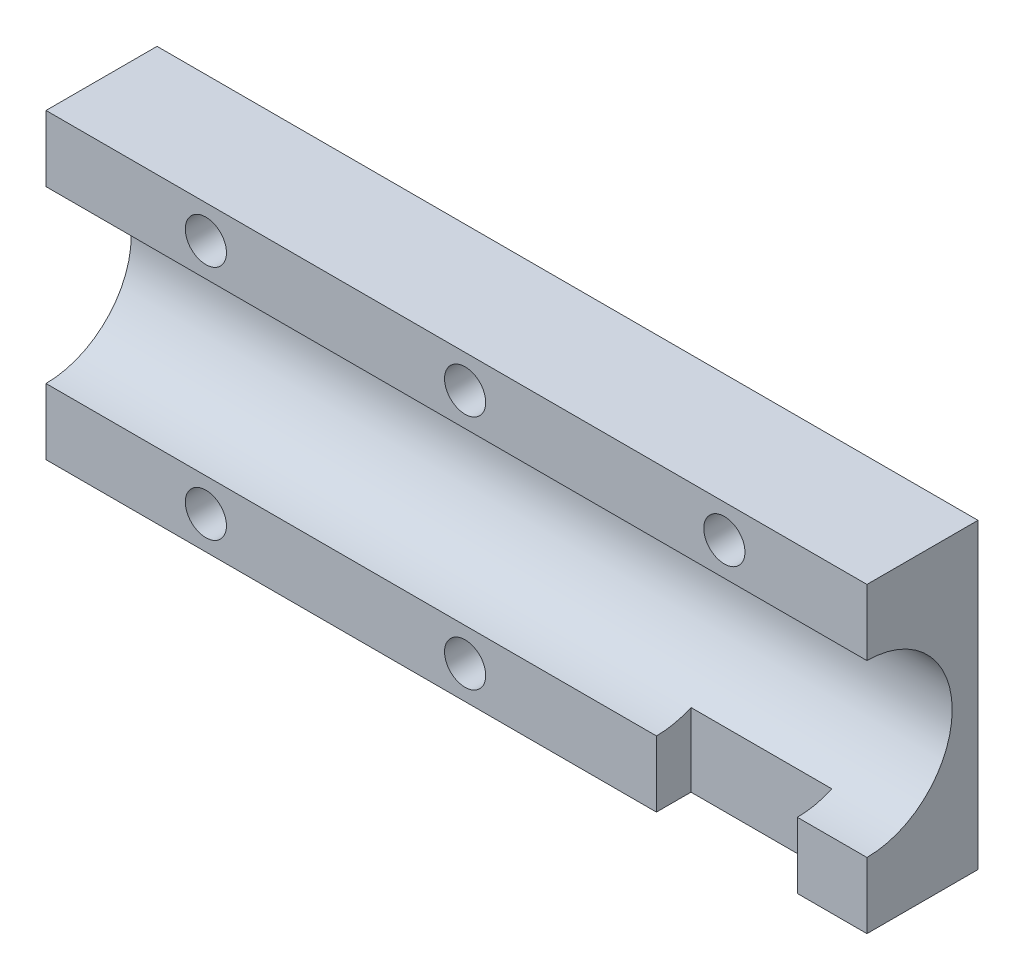
ISO-10303-21;
HEADER;
FILE_DESCRIPTION(('STEP AP214'),'2;1');
FILE_NAME('part.step','',(''),(''),'','','');
FILE_SCHEMA(('AUTOMOTIVE_DESIGN { 1 0 10303 214 1 1 1 1 }'));
ENDSEC;
DATA;
#1=APPLICATION_CONTEXT('core data for automotive mechanical design processes');
#2=APPLICATION_PROTOCOL_DEFINITION('international standard','automotive_design',2000,#1);
#3=PRODUCT_CONTEXT('',#1,'mechanical');
#4=PRODUCT('Part','Part','',(#3));
#5=PRODUCT_RELATED_PRODUCT_CATEGORY('part','',(#4));
#6=PRODUCT_DEFINITION_FORMATION('','',#4);
#7=PRODUCT_DEFINITION_CONTEXT('part definition',#1,'design');
#8=PRODUCT_DEFINITION('design','',#6,#7);
#9=PRODUCT_DEFINITION_SHAPE('','',#8);
#10=(LENGTH_UNIT() NAMED_UNIT(*) SI_UNIT(.MILLI.,.METRE.));
#11=(NAMED_UNIT(*) PLANE_ANGLE_UNIT() SI_UNIT($,.RADIAN.));
#12=(NAMED_UNIT(*) SI_UNIT($,.STERADIAN.) SOLID_ANGLE_UNIT());
#13=UNCERTAINTY_MEASURE_WITH_UNIT(LENGTH_MEASURE(1.E-05),#10,'distance_accuracy_value','');
#14=(GEOMETRIC_REPRESENTATION_CONTEXT(3) GLOBAL_UNCERTAINTY_ASSIGNED_CONTEXT((#13)) GLOBAL_UNIT_ASSIGNED_CONTEXT((#10,
#11,#12)) REPRESENTATION_CONTEXT('',''));
#15=CARTESIAN_POINT('',(0.,0.,0.));
#16=DIRECTION('',(0.,0.,1.));
#17=DIRECTION('',(1.,0.,0.));
#18=AXIS2_PLACEMENT_3D('',#15,#16,#17);
#19=CARTESIAN_POINT('',(-61.595,0.,16.319500000003));
#20=DIRECTION('',(0.,0.,1.));
#21=DIRECTION('',(0.,-1.,0.));
#22=AXIS2_PLACEMENT_3D('',#19,#20,#21);
#23=PLANE('',#22);
#24=CARTESIAN_POINT('',(0.,-17.3759500000011,16.319500000003));
#25=DIRECTION('',(0.,0.,-1.));
#26=DIRECTION('',(1.,0.,0.));
#27=AXIS2_PLACEMENT_3D('',#24,#25,#26);
#28=CIRCLE('',#27,3.0249999999994);
#29=CARTESIAN_POINT('',(3.02499999999938,-17.3759500000011,16.319500000003));
#30=VERTEX_POINT('',#29);
#31=EDGE_CURVE('E157',#30,#30,#28,.T.);
#32=ORIENTED_EDGE('',*,*,#31,.T.);
#33=EDGE_LOOP('',(#32));
#34=FACE_BOUND('',#33,.T.);
#35=CARTESIAN_POINT('',(-38.1,-17.3759500000011,16.319500000003));
#36=DIRECTION('',(0.,0.,-1.));
#37=DIRECTION('',(1.,0.,0.));
#38=AXIS2_PLACEMENT_3D('',#35,#36,#37);
#39=CIRCLE('',#38,3.0249999999994);
#40=CARTESIAN_POINT('',(-35.0750000000006,-17.3759500000011,16.319500000003));
#41=VERTEX_POINT('',#40);
#42=EDGE_CURVE('E151',#41,#41,#39,.T.);
#43=ORIENTED_EDGE('',*,*,#42,.T.);
#44=EDGE_LOOP('',(#43));
#45=FACE_BOUND('',#44,.T.);
#46=DIRECTION('',(0.,-1.,0.));
#47=VECTOR('',#46,1.);
#48=CARTESIAN_POINT('',(28.1162516469234,-12.5268999999962,16.319500000003));
#49=LINE('',#48,#47);
#50=CARTESIAN_POINT('',(28.1162516469234,-12.5268999999962,16.319500000003));
#51=VERTEX_POINT('',#50);
#52=CARTESIAN_POINT('',(28.1162516469234,-22.225,16.319500000003));
#53=VERTEX_POINT('',#52);
#54=EDGE_CURVE('E178',#51,#53,#49,.T.);
#55=ORIENTED_EDGE('',*,*,#54,.F.);
#56=DIRECTION('',(1.,0.,0.));
#57=VECTOR('',#56,1.);
#58=CARTESIAN_POINT('',(-61.595,-12.5268999999962,16.319500000003));
#59=LINE('',#58,#57);
#60=CARTESIAN_POINT('',(-61.595,-12.5268999999962,16.319500000003));
#61=VERTEX_POINT('',#60);
#62=EDGE_CURVE('E213',#61,#51,#59,.T.);
#63=ORIENTED_EDGE('',*,*,#62,.F.);
#64=DIRECTION('',(0.,-1.,0.));
#65=VECTOR('',#64,1.);
#66=CARTESIAN_POINT('',(-61.595,0.,16.319500000003));
#67=LINE('',#66,#65);
#68=CARTESIAN_POINT('',(-61.595,-22.225,16.319500000003));
#69=VERTEX_POINT('',#68);
#70=EDGE_CURVE('E136',#61,#69,#67,.T.);
#71=ORIENTED_EDGE('',*,*,#70,.T.);
#72=DIRECTION('',(1.,0.,0.));
#73=VECTOR('',#72,1.);
#74=CARTESIAN_POINT('',(-61.595,-22.225,16.319500000003));
#75=LINE('',#74,#73);
#76=EDGE_CURVE('E132',#69,#53,#75,.T.);
#77=ORIENTED_EDGE('',*,*,#76,.T.);
#78=EDGE_LOOP('',(#55,#63,#71,#77));
#79=FACE_BOUND('',#78,.T.);
#80=ADVANCED_FACE('F41',(#34,#45,#79),#23,.T.);
#81=CARTESIAN_POINT('',(59.055,22.225,2.));
#82=DIRECTION('',(-1.,0.,0.));
#83=DIRECTION('',(0.,-1.,0.));
#84=AXIS2_PLACEMENT_3D('',#81,#82,#83);
#85=PLANE('',#84);
#86=DIRECTION('',(0.,1.,0.));
#87=VECTOR('',#86,1.);
#88=CARTESIAN_POINT('',(59.055,22.225,0.));
#89=LINE('',#88,#87);
#90=CARTESIAN_POINT('',(59.055,-22.225,0.));
#91=VERTEX_POINT('',#90);
#92=CARTESIAN_POINT('',(59.055,22.225,0.));
#93=VERTEX_POINT('',#92);
#94=EDGE_CURVE('E124',#91,#93,#89,.T.);
#95=ORIENTED_EDGE('',*,*,#94,.T.);
#96=DIRECTION('',(0.,0.,-1.));
#97=VECTOR('',#96,1.);
#98=CARTESIAN_POINT('',(59.055,22.225,2.));
#99=LINE('',#98,#97);
#100=CARTESIAN_POINT('',(59.055,22.225,16.319500000003));
#101=VERTEX_POINT('',#100);
#102=EDGE_CURVE('E11',#101,#93,#99,.T.);
#103=ORIENTED_EDGE('',*,*,#102,.F.);
#104=DIRECTION('',(0.,-1.,0.));
#105=VECTOR('',#104,1.);
#106=CARTESIAN_POINT('',(59.055,0.,16.319500000003));
#107=LINE('',#106,#105);
#108=CARTESIAN_POINT('',(59.055,12.5269000000038,16.319500000003));
#109=VERTEX_POINT('',#108);
#110=EDGE_CURVE('E202',#101,#109,#107,.T.);
#111=ORIENTED_EDGE('',*,*,#110,.T.);
#112=CARTESIAN_POINT('',(59.055,3.76058311475041E-12,16.319500000003));
#113=DIRECTION('',(-1.,0.,0.));
#114=DIRECTION('',(0.,0.,1.));
#115=AXIS2_PLACEMENT_3D('',#112,#113,#114);
#116=CIRCLE('',#115,12.5269);
#117=CARTESIAN_POINT('',(59.055,-12.5268999999962,16.319500000003));
#118=VERTEX_POINT('',#117);
#119=EDGE_CURVE('E197',#109,#118,#116,.T.);
#120=ORIENTED_EDGE('',*,*,#119,.T.);
#121=CARTESIAN_POINT('',(59.055,-22.225,16.319500000003));
#122=VERTEX_POINT('',#121);
#123=EDGE_CURVE('E205',#118,#122,#107,.T.);
#124=ORIENTED_EDGE('',*,*,#123,.T.);
#125=DIRECTION('',(0.,0.,-1.));
#126=VECTOR('',#125,1.);
#127=CARTESIAN_POINT('',(59.055,-22.225,2.));
#128=LINE('',#127,#126);
#129=EDGE_CURVE('E49',#122,#91,#128,.T.);
#130=ORIENTED_EDGE('',*,*,#129,.T.);
#131=EDGE_LOOP('',(#95,#103,#111,#120,#124,#130));
#132=FACE_BOUND('',#131,.T.);
#133=ADVANCED_FACE('F43',(#132),#85,.F.);
#134=CARTESIAN_POINT('',(-59.055,22.225,2.));
#135=DIRECTION('',(0.,-1.,0.));
#136=DIRECTION('',(0.,0.,-1.));
#137=AXIS2_PLACEMENT_3D('',#134,#135,#136);
#138=PLANE('',#137);
#139=DIRECTION('',(-1.,0.,0.));
#140=VECTOR('',#139,1.);
#141=CARTESIAN_POINT('',(-59.055,22.225,0.));
#142=LINE('',#141,#140);
#143=CARTESIAN_POINT('',(-61.595,22.225,0.));
#144=VERTEX_POINT('',#143);
#145=EDGE_CURVE('E125',#93,#144,#142,.T.);
#146=ORIENTED_EDGE('',*,*,#145,.T.);
#147=DIRECTION('',(0.,0.,1.));
#148=VECTOR('',#147,1.);
#149=CARTESIAN_POINT('',(-61.595,22.225,0.));
#150=LINE('',#149,#148);
#151=CARTESIAN_POINT('',(-61.595,22.225,16.319500000003));
#152=VERTEX_POINT('',#151);
#153=EDGE_CURVE('E137',#144,#152,#150,.T.);
#154=ORIENTED_EDGE('',*,*,#153,.T.);
#155=DIRECTION('',(1.,0.,0.));
#156=VECTOR('',#155,1.);
#157=CARTESIAN_POINT('',(-61.595,22.225,16.319500000003));
#158=LINE('',#157,#156);
#159=EDGE_CURVE('E219',#152,#101,#158,.T.);
#160=ORIENTED_EDGE('',*,*,#159,.T.);
#161=ORIENTED_EDGE('',*,*,#102,.T.);
#162=EDGE_LOOP('',(#146,#154,#160,#161));
#163=FACE_BOUND('',#162,.T.);
#164=ADVANCED_FACE('F248',(#163),#138,.F.);
#165=CARTESIAN_POINT('',(-59.055,-22.225,2.));
#166=DIRECTION('',(0.,1.,0.));
#167=DIRECTION('',(0.,0.,1.));
#168=AXIS2_PLACEMENT_3D('',#165,#166,#167);
#169=PLANE('',#168);
#170=DIRECTION('',(0.,0.,1.));
#171=VECTOR('',#170,1.);
#172=CARTESIAN_POINT('',(-61.595,-22.225,0.));
#173=LINE('',#172,#171);
#174=CARTESIAN_POINT('',(-61.595,-22.225,0.));
#175=VERTEX_POINT('',#174);
#176=EDGE_CURVE('E128',#175,#69,#173,.T.);
#177=ORIENTED_EDGE('',*,*,#176,.F.);
#178=DIRECTION('',(1.,0.,0.));
#179=VECTOR('',#178,1.);
#180=CARTESIAN_POINT('',(-59.055,-22.225,0.));
#181=LINE('',#180,#179);
#182=EDGE_CURVE('E64',#175,#91,#181,.T.);
#183=ORIENTED_EDGE('',*,*,#182,.T.);
#184=ORIENTED_EDGE('',*,*,#129,.F.);
#185=CARTESIAN_POINT('',(48.8246199257231,-22.225,16.319500000003));
#186=VERTEX_POINT('',#185);
#187=EDGE_CURVE('E216',#186,#122,#75,.T.);
#188=ORIENTED_EDGE('',*,*,#187,.F.);
#189=DIRECTION('',(0.,0.,1.));
#190=VECTOR('',#189,1.);
#191=CARTESIAN_POINT('',(48.8246199257231,-22.225,11.239500000003));
#192=LINE('',#191,#190);
#193=CARTESIAN_POINT('',(48.8246199257231,-22.225,11.239500000003));
#194=VERTEX_POINT('',#193);
#195=EDGE_CURVE('E56',#194,#186,#192,.T.);
#196=ORIENTED_EDGE('',*,*,#195,.F.);
#197=DIRECTION('',(1.,0.,0.));
#198=VECTOR('',#197,1.);
#199=CARTESIAN_POINT('',(28.1162516469234,-22.225,11.239500000003));
#200=LINE('',#199,#198);
#201=CARTESIAN_POINT('',(28.1162516469234,-22.225,11.239500000003));
#202=VERTEX_POINT('',#201);
#203=EDGE_CURVE('E182',#202,#194,#200,.T.);
#204=ORIENTED_EDGE('',*,*,#203,.F.);
#205=DIRECTION('',(0.,0.,1.));
#206=VECTOR('',#205,1.);
#207=CARTESIAN_POINT('',(28.1162516469234,-22.225,11.239500000003));
#208=LINE('',#207,#206);
#209=EDGE_CURVE('E188',#202,#53,#208,.T.);
#210=ORIENTED_EDGE('',*,*,#209,.T.);
#211=ORIENTED_EDGE('',*,*,#76,.F.);
#212=EDGE_LOOP('',(#177,#183,#184,#188,#196,#204,#210,#211));
#213=FACE_BOUND('',#212,.T.);
#214=ADVANCED_FACE('F129',(#213),#169,.F.);
#215=CARTESIAN_POINT('',(0.,0.,0.));
#216=DIRECTION('',(0.,0.,1.));
#217=DIRECTION('',(1.,0.,0.));
#218=AXIS2_PLACEMENT_3D('',#215,#216,#217);
#219=PLANE('',#218);
#220=ORIENTED_EDGE('',*,*,#94,.F.);
#221=ORIENTED_EDGE('',*,*,#182,.F.);
#222=DIRECTION('',(0.,-1.,0.));
#223=VECTOR('',#222,1.);
#224=CARTESIAN_POINT('',(-61.595,22.225,0.));
#225=LINE('',#224,#223);
#226=EDGE_CURVE('E122',#144,#175,#225,.T.);
#227=ORIENTED_EDGE('',*,*,#226,.F.);
#228=ORIENTED_EDGE('',*,*,#145,.F.);
#229=EDGE_LOOP('',(#220,#221,#227,#228));
#230=FACE_BOUND('',#229,.T.);
#231=ADVANCED_FACE('F120',(#230),#219,.F.);
#232=CARTESIAN_POINT('',(-61.595,3.76058311475041E-12,16.319500000003));
#233=DIRECTION('',(1.,0.,0.));
#234=DIRECTION('',(0.,0.,-1.));
#235=AXIS2_PLACEMENT_3D('',#232,#233,#234);
#236=CYLINDRICAL_SURFACE('',#235,12.5269);
#237=CARTESIAN_POINT('',(48.8246199257231,3.76058311475041E-12,16.319500000003));
#238=DIRECTION('',(1.,0.,0.));
#239=DIRECTION('',(0.,0.,-1.));
#240=AXIS2_PLACEMENT_3D('',#237,#238,#239);
#241=CIRCLE('',#240,12.5269);
#242=CARTESIAN_POINT('',(48.8246199257231,-12.5268999999962,16.319500000003));
#243=VERTEX_POINT('',#242);
#244=CARTESIAN_POINT('',(48.8246199257231,-11.4506254680657,11.239500000003));
#245=VERTEX_POINT('',#244);
#246=EDGE_CURVE('E175',#243,#245,#241,.T.);
#247=ORIENTED_EDGE('',*,*,#246,.F.);
#248=EDGE_CURVE('E217',#243,#118,#59,.T.);
#249=ORIENTED_EDGE('',*,*,#248,.T.);
#250=ORIENTED_EDGE('',*,*,#119,.F.);
#251=DIRECTION('',(1.,0.,0.));
#252=VECTOR('',#251,1.);
#253=CARTESIAN_POINT('',(-61.595,12.5269000000038,16.319500000003));
#254=LINE('',#253,#252);
#255=CARTESIAN_POINT('',(-61.595,12.5269000000038,16.319500000003));
#256=VERTEX_POINT('',#255);
#257=EDGE_CURVE('E222',#256,#109,#254,.T.);
#258=ORIENTED_EDGE('',*,*,#257,.F.);
#259=CARTESIAN_POINT('',(-61.595,3.76058311475041E-12,16.319500000003));
#260=DIRECTION('',(-1.,0.,0.));
#261=DIRECTION('',(0.,0.,1.));
#262=AXIS2_PLACEMENT_3D('',#259,#260,#261);
#263=CIRCLE('',#262,12.5269);
#264=EDGE_CURVE('E206',#256,#61,#263,.T.);
#265=ORIENTED_EDGE('',*,*,#264,.T.);
#266=ORIENTED_EDGE('',*,*,#62,.T.);
#267=CARTESIAN_POINT('',(28.1162516469234,3.76058311475041E-12,16.319500000003));
#268=DIRECTION('',(-1.,0.,0.));
#269=DIRECTION('',(0.,0.,1.));
#270=AXIS2_PLACEMENT_3D('',#267,#268,#269);
#271=CIRCLE('',#270,12.5269);
#272=CARTESIAN_POINT('',(28.1162516469234,-11.4506254680657,11.239500000003));
#273=VERTEX_POINT('',#272);
#274=EDGE_CURVE('E168',#273,#51,#271,.T.);
#275=ORIENTED_EDGE('',*,*,#274,.F.);
#276=DIRECTION('',(1.,0.,0.));
#277=VECTOR('',#276,1.);
#278=CARTESIAN_POINT('',(-61.595,-11.4506254680657,11.239500000003));
#279=LINE('',#278,#277);
#280=EDGE_CURVE('E172',#245,#273,#279,.F.);
#281=ORIENTED_EDGE('',*,*,#280,.F.);
#282=EDGE_LOOP('',(#247,#249,#250,#258,#265,#266,#275,#281));
#283=FACE_BOUND('',#282,.T.);
#284=ADVANCED_FACE('F237',(#283),#236,.F.);
#285=CARTESIAN_POINT('',(38.1,17.3759500000011,16.319500000003));
#286=DIRECTION('',(0.,0.,1.));
#287=DIRECTION('',(1.,0.,0.));
#288=AXIS2_PLACEMENT_3D('',#285,#286,#287);
#289=CIRCLE('',#288,3.0249999999994);
#290=CARTESIAN_POINT('',(41.1249999999994,17.3759500000011,16.319500000003));
#291=VERTEX_POINT('',#290);
#292=EDGE_CURVE('E144',#291,#291,#289,.T.);
#293=ORIENTED_EDGE('',*,*,#292,.F.);
#294=EDGE_LOOP('',(#293));
#295=FACE_BOUND('',#294,.T.);
#296=CARTESIAN_POINT('',(-38.1,17.3759500000011,16.319500000003));
#297=DIRECTION('',(0.,0.,1.));
#298=DIRECTION('',(1.,0.,0.));
#299=AXIS2_PLACEMENT_3D('',#296,#297,#298);
#300=CIRCLE('',#299,3.0249999999994);
#301=CARTESIAN_POINT('',(-35.0750000000006,17.3759500000011,16.319500000003));
#302=VERTEX_POINT('',#301);
#303=EDGE_CURVE('E156',#302,#302,#300,.T.);
#304=ORIENTED_EDGE('',*,*,#303,.F.);
#305=EDGE_LOOP('',(#304));
#306=FACE_BOUND('',#305,.T.);
#307=CARTESIAN_POINT('',(0.,17.3759500000011,16.319500000003));
#308=DIRECTION('',(0.,0.,1.));
#309=DIRECTION('',(1.,0.,0.));
#310=AXIS2_PLACEMENT_3D('',#307,#308,#309);
#311=CIRCLE('',#310,3.0249999999994);
#312=CARTESIAN_POINT('',(3.02499999999938,17.3759500000011,16.319500000003));
#313=VERTEX_POINT('',#312);
#314=EDGE_CURVE('E192',#313,#313,#311,.T.);
#315=ORIENTED_EDGE('',*,*,#314,.F.);
#316=EDGE_LOOP('',(#315));
#317=FACE_BOUND('',#316,.T.);
#318=ORIENTED_EDGE('',*,*,#257,.T.);
#319=ORIENTED_EDGE('',*,*,#110,.F.);
#320=ORIENTED_EDGE('',*,*,#159,.F.);
#321=EDGE_CURVE('E209',#152,#256,#67,.T.);
#322=ORIENTED_EDGE('',*,*,#321,.T.);
#323=EDGE_LOOP('',(#318,#319,#320,#322));
#324=FACE_BOUND('',#323,.T.);
#325=ADVANCED_FACE('F246',(#295,#306,#317,#324),#23,.T.);
#326=DIRECTION('',(0.,1.,0.));
#327=VECTOR('',#326,1.);
#328=CARTESIAN_POINT('',(48.8246199257231,-12.5268999999962,16.319500000003));
#329=LINE('',#328,#327);
#330=EDGE_CURVE('E183',#186,#243,#329,.T.);
#331=ORIENTED_EDGE('',*,*,#330,.F.);
#332=ORIENTED_EDGE('',*,*,#187,.T.);
#333=ORIENTED_EDGE('',*,*,#123,.F.);
#334=ORIENTED_EDGE('',*,*,#248,.F.);
#335=EDGE_LOOP('',(#331,#332,#333,#334));
#336=FACE_BOUND('',#335,.T.);
#337=ADVANCED_FACE('F231',(#336),#23,.T.);
#338=CARTESIAN_POINT('',(-61.595,0.,0.));
#339=DIRECTION('',(-1.,0.,0.));
#340=DIRECTION('',(0.,0.,1.));
#341=AXIS2_PLACEMENT_3D('',#338,#339,#340);
#342=PLANE('',#341);
#343=ORIENTED_EDGE('',*,*,#264,.F.);
#344=ORIENTED_EDGE('',*,*,#321,.F.);
#345=ORIENTED_EDGE('',*,*,#153,.F.);
#346=ORIENTED_EDGE('',*,*,#226,.T.);
#347=ORIENTED_EDGE('',*,*,#176,.T.);
#348=ORIENTED_EDGE('',*,*,#70,.F.);
#349=EDGE_LOOP('',(#343,#344,#345,#346,#347,#348));
#350=FACE_BOUND('',#349,.T.);
#351=ADVANCED_FACE('F141',(#350),#342,.T.);
#352=CARTESIAN_POINT('',(0.,17.3759500000011,8.31950000000301));
#353=DIRECTION('',(0.,0.,1.));
#354=DIRECTION('',(1.,0.,0.));
#355=AXIS2_PLACEMENT_3D('',#352,#353,#354);
#356=CYLINDRICAL_SURFACE('',#355,3.0249999999994);
#357=CARTESIAN_POINT('',(0.,17.3759500000011,8.31950000000301));
#358=DIRECTION('',(0.,0.,1.));
#359=DIRECTION('',(1.,0.,0.));
#360=AXIS2_PLACEMENT_3D('',#357,#358,#359);
#361=CIRCLE('',#360,3.0249999999994);
#362=CARTESIAN_POINT('',(3.02499999999938,17.3759500000011,8.31950000000301));
#363=VERTEX_POINT('',#362);
#364=EDGE_CURVE('E194',#363,#363,#361,.T.);
#365=ORIENTED_EDGE('',*,*,#364,.F.);
#366=EDGE_LOOP('',(#365));
#367=FACE_BOUND('',#366,.T.);
#368=ORIENTED_EDGE('',*,*,#314,.T.);
#369=EDGE_LOOP('',(#368));
#370=FACE_BOUND('',#369,.T.);
#371=ADVANCED_FACE('F269',(#367,#370),#356,.F.);
#372=CARTESIAN_POINT('',(0.,17.3759500000011,8.31950000000301));
#373=DIRECTION('',(0.,0.,1.));
#374=DIRECTION('',(1.,0.,0.));
#375=AXIS2_PLACEMENT_3D('',#372,#373,#374);
#376=PLANE('',#375);
#377=ORIENTED_EDGE('',*,*,#364,.T.);
#378=EDGE_LOOP('',(#377));
#379=FACE_BOUND('',#378,.T.);
#380=ADVANCED_FACE('F273',(#379),#376,.T.);
#381=CARTESIAN_POINT('',(28.1162516469234,-12.5268999999962,11.239500000003));
#382=DIRECTION('',(-1.,0.,0.));
#383=DIRECTION('',(0.,0.,1.));
#384=AXIS2_PLACEMENT_3D('',#381,#382,#383);
#385=PLANE('',#384);
#386=ORIENTED_EDGE('',*,*,#54,.T.);
#387=ORIENTED_EDGE('',*,*,#209,.F.);
#388=DIRECTION('',(0.,-1.,0.));
#389=VECTOR('',#388,1.);
#390=CARTESIAN_POINT('',(28.1162516469234,-12.5268999999962,11.239500000003));
#391=LINE('',#390,#389);
#392=EDGE_CURVE('E179',#273,#202,#391,.T.);
#393=ORIENTED_EDGE('',*,*,#392,.F.);
#394=ORIENTED_EDGE('',*,*,#274,.T.);
#395=EDGE_LOOP('',(#386,#387,#393,#394));
#396=FACE_BOUND('',#395,.T.);
#397=ADVANCED_FACE('F279',(#396),#385,.F.);
#398=CARTESIAN_POINT('',(48.8246199257231,-12.5268999999962,11.239500000003));
#399=DIRECTION('',(1.,0.,0.));
#400=DIRECTION('',(0.,0.,-1.));
#401=AXIS2_PLACEMENT_3D('',#398,#399,#400);
#402=PLANE('',#401);
#403=ORIENTED_EDGE('',*,*,#330,.T.);
#404=ORIENTED_EDGE('',*,*,#246,.T.);
#405=DIRECTION('',(0.,1.,0.));
#406=VECTOR('',#405,1.);
#407=CARTESIAN_POINT('',(48.8246199257231,-12.5268999999962,11.239500000003));
#408=LINE('',#407,#406);
#409=EDGE_CURVE('E186',#194,#245,#408,.T.);
#410=ORIENTED_EDGE('',*,*,#409,.F.);
#411=ORIENTED_EDGE('',*,*,#195,.T.);
#412=EDGE_LOOP('',(#403,#404,#410,#411));
#413=FACE_BOUND('',#412,.T.);
#414=ADVANCED_FACE('F233',(#413),#402,.F.);
#415=CARTESIAN_POINT('',(0.,0.,11.239500000003));
#416=DIRECTION('',(0.,0.,1.));
#417=DIRECTION('',(1.,0.,0.));
#418=AXIS2_PLACEMENT_3D('',#415,#416,#417);
#419=PLANE('',#418);
#420=ORIENTED_EDGE('',*,*,#392,.T.);
#421=ORIENTED_EDGE('',*,*,#203,.T.);
#422=ORIENTED_EDGE('',*,*,#409,.T.);
#423=ORIENTED_EDGE('',*,*,#280,.T.);
#424=EDGE_LOOP('',(#420,#421,#422,#423));
#425=FACE_BOUND('',#424,.T.);
#426=ADVANCED_FACE('F239',(#425),#419,.T.);
#427=CARTESIAN_POINT('',(-38.1,17.3759500000011,8.31950000000301));
#428=DIRECTION('',(0.,0.,1.));
#429=DIRECTION('',(1.,0.,0.));
#430=AXIS2_PLACEMENT_3D('',#427,#428,#429);
#431=CYLINDRICAL_SURFACE('',#430,3.0249999999994);
#432=CARTESIAN_POINT('',(-38.1,17.3759500000011,8.31950000000301));
#433=DIRECTION('',(0.,0.,1.));
#434=DIRECTION('',(1.,0.,0.));
#435=AXIS2_PLACEMENT_3D('',#432,#433,#434);
#436=CIRCLE('',#435,3.0249999999994);
#437=CARTESIAN_POINT('',(-35.0750000000006,17.3759500000011,8.31950000000301));
#438=VERTEX_POINT('',#437);
#439=EDGE_CURVE('E165',#438,#438,#436,.T.);
#440=ORIENTED_EDGE('',*,*,#439,.F.);
#441=EDGE_LOOP('',(#440));
#442=FACE_BOUND('',#441,.T.);
#443=ORIENTED_EDGE('',*,*,#303,.T.);
#444=EDGE_LOOP('',(#443));
#445=FACE_BOUND('',#444,.T.);
#446=ADVANCED_FACE('F287',(#442,#445),#431,.F.);
#447=CARTESIAN_POINT('',(-38.1,17.3759500000011,8.31950000000301));
#448=DIRECTION('',(0.,0.,1.));
#449=DIRECTION('',(1.,0.,0.));
#450=AXIS2_PLACEMENT_3D('',#447,#448,#449);
#451=PLANE('',#450);
#452=ORIENTED_EDGE('',*,*,#439,.T.);
#453=EDGE_LOOP('',(#452));
#454=FACE_BOUND('',#453,.T.);
#455=ADVANCED_FACE('F290',(#454),#451,.T.);
#456=CARTESIAN_POINT('',(-38.1,-17.3759500000011,8.31950000000301));
#457=DIRECTION('',(0.,0.,1.));
#458=DIRECTION('',(1.,0.,0.));
#459=AXIS2_PLACEMENT_3D('',#456,#457,#458);
#460=CYLINDRICAL_SURFACE('',#459,3.0249999999994);
#461=CARTESIAN_POINT('',(-38.1,-17.3759500000011,8.31950000000301));
#462=DIRECTION('',(0.,0.,-1.));
#463=DIRECTION('',(1.,0.,0.));
#464=AXIS2_PLACEMENT_3D('',#461,#462,#463);
#465=CIRCLE('',#464,3.0249999999994);
#466=CARTESIAN_POINT('',(-35.0750000000006,-17.3759500000011,8.31950000000301));
#467=VERTEX_POINT('',#466);
#468=EDGE_CURVE('E160',#467,#467,#465,.T.);
#469=ORIENTED_EDGE('',*,*,#468,.T.);
#470=EDGE_LOOP('',(#469));
#471=FACE_BOUND('',#470,.T.);
#472=ORIENTED_EDGE('',*,*,#42,.F.);
#473=EDGE_LOOP('',(#472));
#474=FACE_BOUND('',#473,.T.);
#475=ADVANCED_FACE('F294',(#471,#474),#460,.F.);
#476=CARTESIAN_POINT('',(-38.1,-17.3759500000011,8.31950000000301));
#477=DIRECTION('',(0.,0.,1.));
#478=DIRECTION('',(1.,0.,0.));
#479=AXIS2_PLACEMENT_3D('',#476,#477,#478);
#480=PLANE('',#479);
#481=ORIENTED_EDGE('',*,*,#468,.F.);
#482=EDGE_LOOP('',(#481));
#483=FACE_BOUND('',#482,.T.);
#484=ADVANCED_FACE('F298',(#483),#480,.T.);
#485=CARTESIAN_POINT('',(0.,-17.3759500000011,8.31950000000301));
#486=DIRECTION('',(0.,0.,1.));
#487=DIRECTION('',(1.,0.,0.));
#488=AXIS2_PLACEMENT_3D('',#485,#486,#487);
#489=CYLINDRICAL_SURFACE('',#488,3.0249999999994);
#490=CARTESIAN_POINT('',(0.,-17.3759500000011,8.31950000000301));
#491=DIRECTION('',(0.,0.,-1.));
#492=DIRECTION('',(1.,0.,0.));
#493=AXIS2_PLACEMENT_3D('',#490,#491,#492);
#494=CIRCLE('',#493,3.0249999999994);
#495=CARTESIAN_POINT('',(3.02499999999938,-17.3759500000011,8.31950000000301));
#496=VERTEX_POINT('',#495);
#497=EDGE_CURVE('E153',#496,#496,#494,.T.);
#498=ORIENTED_EDGE('',*,*,#497,.T.);
#499=EDGE_LOOP('',(#498));
#500=FACE_BOUND('',#499,.T.);
#501=ORIENTED_EDGE('',*,*,#31,.F.);
#502=EDGE_LOOP('',(#501));
#503=FACE_BOUND('',#502,.T.);
#504=ADVANCED_FACE('F302',(#500,#503),#489,.F.);
#505=CARTESIAN_POINT('',(0.,-17.3759500000011,8.31950000000301));
#506=DIRECTION('',(0.,0.,1.));
#507=DIRECTION('',(1.,0.,0.));
#508=AXIS2_PLACEMENT_3D('',#505,#506,#507);
#509=PLANE('',#508);
#510=ORIENTED_EDGE('',*,*,#497,.F.);
#511=EDGE_LOOP('',(#510));
#512=FACE_BOUND('',#511,.T.);
#513=ADVANCED_FACE('F306',(#512),#509,.T.);
#514=CARTESIAN_POINT('',(38.1,17.3759500000011,8.31950000000301));
#515=DIRECTION('',(0.,0.,1.));
#516=DIRECTION('',(1.,0.,0.));
#517=AXIS2_PLACEMENT_3D('',#514,#515,#516);
#518=CYLINDRICAL_SURFACE('',#517,3.0249999999994);
#519=CARTESIAN_POINT('',(38.1,17.3759500000011,8.31950000000301));
#520=DIRECTION('',(0.,0.,1.));
#521=DIRECTION('',(1.,0.,0.));
#522=AXIS2_PLACEMENT_3D('',#519,#520,#521);
#523=CIRCLE('',#522,3.0249999999994);
#524=CARTESIAN_POINT('',(41.1249999999994,17.3759500000011,8.31950000000301));
#525=VERTEX_POINT('',#524);
#526=EDGE_CURVE('E147',#525,#525,#523,.T.);
#527=ORIENTED_EDGE('',*,*,#526,.F.);
#528=EDGE_LOOP('',(#527));
#529=FACE_BOUND('',#528,.T.);
#530=ORIENTED_EDGE('',*,*,#292,.T.);
#531=EDGE_LOOP('',(#530));
#532=FACE_BOUND('',#531,.T.);
#533=ADVANCED_FACE('F310',(#529,#532),#518,.F.);
#534=CARTESIAN_POINT('',(38.1,17.3759500000011,8.31950000000301));
#535=DIRECTION('',(0.,0.,1.));
#536=DIRECTION('',(1.,0.,0.));
#537=AXIS2_PLACEMENT_3D('',#534,#535,#536);
#538=PLANE('',#537);
#539=ORIENTED_EDGE('',*,*,#526,.T.);
#540=EDGE_LOOP('',(#539));
#541=FACE_BOUND('',#540,.T.);
#542=ADVANCED_FACE('F314',(#541),#538,.T.);
#543=CLOSED_SHELL('',(#80,#133,#164,#214,#231,#284,#325,#337,#351,#371,#380,#397,#414,#426,#446,
#455,#475,#484,#504,#513,#533,#542));
#544=MANIFOLD_SOLID_BREP('B2',#543);
#545=ADVANCED_BREP_SHAPE_REPRESENTATION('',(#18,#544),#14);
#546=SHAPE_DEFINITION_REPRESENTATION(#9,#545);
ENDSEC;
END-ISO-10303-21;
